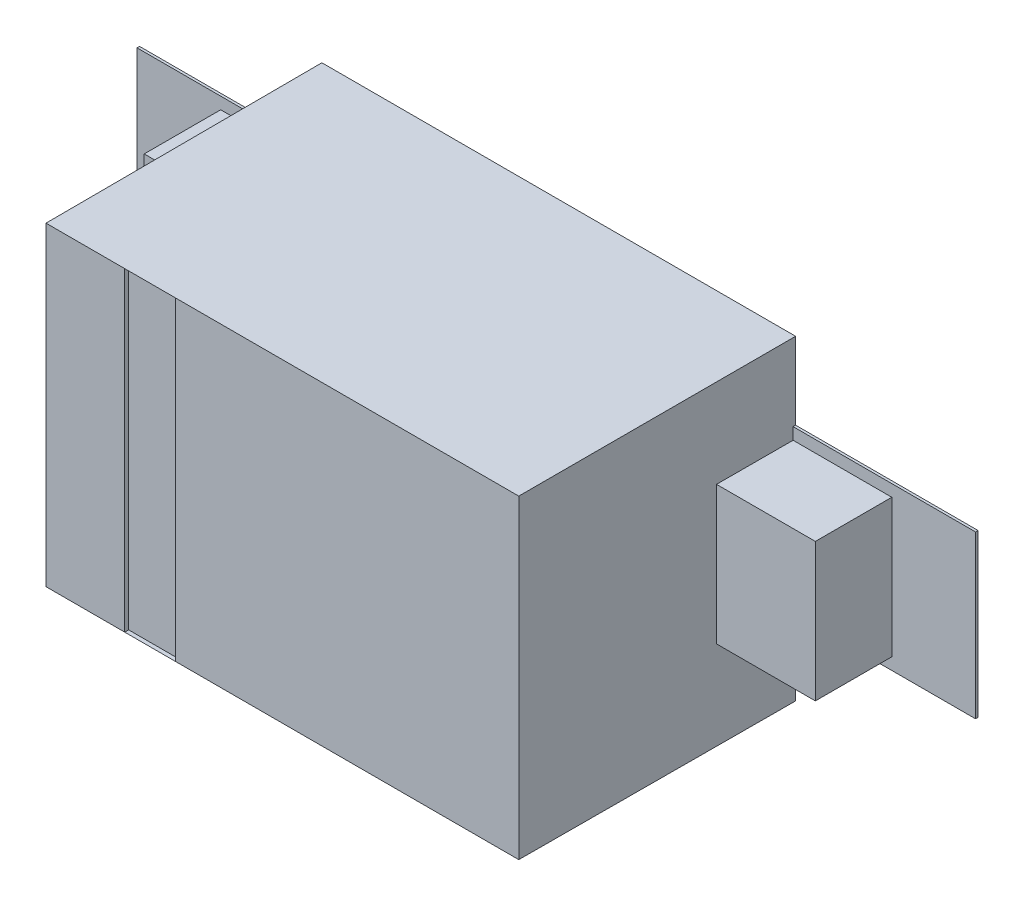
ISO-10303-21;
HEADER;
FILE_DESCRIPTION(('STEP AP214'),'2;1');
FILE_NAME('part.step','',(''),(''),'','','');
FILE_SCHEMA(('AUTOMOTIVE_DESIGN { 1 0 10303 214 1 1 1 1 }'));
ENDSEC;
DATA;
#1=APPLICATION_CONTEXT('core data for automotive mechanical design processes');
#2=APPLICATION_PROTOCOL_DEFINITION('international standard','automotive_design',2000,#1);
#3=PRODUCT_CONTEXT('',#1,'mechanical');
#4=PRODUCT('Part','Part','',(#3));
#5=PRODUCT_RELATED_PRODUCT_CATEGORY('part','',(#4));
#6=PRODUCT_DEFINITION_FORMATION('','',#4);
#7=PRODUCT_DEFINITION_CONTEXT('part definition',#1,'design');
#8=PRODUCT_DEFINITION('design','',#6,#7);
#9=PRODUCT_DEFINITION_SHAPE('','',#8);
#10=(LENGTH_UNIT() NAMED_UNIT(*) SI_UNIT(.MILLI.,.METRE.));
#11=(NAMED_UNIT(*) PLANE_ANGLE_UNIT() SI_UNIT($,.RADIAN.));
#12=(NAMED_UNIT(*) SI_UNIT($,.STERADIAN.) SOLID_ANGLE_UNIT());
#13=UNCERTAINTY_MEASURE_WITH_UNIT(LENGTH_MEASURE(1.E-05),#10,'distance_accuracy_value','');
#14=(GEOMETRIC_REPRESENTATION_CONTEXT(3) GLOBAL_UNCERTAINTY_ASSIGNED_CONTEXT((#13)) GLOBAL_UNIT_ASSIGNED_CONTEXT((#10,
#11,#12)) REPRESENTATION_CONTEXT('',''));
#15=CARTESIAN_POINT('',(0.,0.,0.));
#16=DIRECTION('',(0.,0.,1.));
#17=DIRECTION('',(1.,0.,0.));
#18=AXIS2_PLACEMENT_3D('',#15,#16,#17);
#19=CARTESIAN_POINT('',(0.849999999999902,0.175000000000011,0.0030000000000007));
#20=DIRECTION('',(1.,0.,0.));
#21=DIRECTION('',(0.,0.,-1.));
#22=AXIS2_PLACEMENT_3D('',#19,#20,#21);
#23=PLANE('',#22);
#24=DIRECTION('',(0.,0.,-1.));
#25=VECTOR('',#24,1.);
#26=CARTESIAN_POINT('',(0.849999999999902,-0.175000000000011,0.0030000000000007));
#27=LINE('',#26,#25);
#28=CARTESIAN_POINT('',(0.849999999999902,-0.175000000000011,0.0093500000000007));
#29=VERTEX_POINT('',#28);
#30=CARTESIAN_POINT('',(0.849999999999902,-0.175000000000011,0.203000000000001));
#31=VERTEX_POINT('',#30);
#32=EDGE_CURVE('E175',#29,#31,#27,.F.);
#33=ORIENTED_EDGE('',*,*,#32,.F.);
#34=DIRECTION('',(0.,1.,0.));
#35=VECTOR('',#34,1.);
#36=CARTESIAN_POINT('',(0.849999999999902,0.,0.0093500000000007));
#37=LINE('',#36,#35);
#38=CARTESIAN_POINT('',(0.849999999999902,0.175000000000011,0.0093500000000007));
#39=VERTEX_POINT('',#38);
#40=EDGE_CURVE('E182',#29,#39,#37,.T.);
#41=ORIENTED_EDGE('',*,*,#40,.T.);
#42=DIRECTION('',(0.,0.,1.));
#43=VECTOR('',#42,1.);
#44=CARTESIAN_POINT('',(0.849999999999902,0.175000000000011,0.0030000000000007));
#45=LINE('',#44,#43);
#46=CARTESIAN_POINT('',(0.849999999999902,0.175000000000011,0.203000000000001));
#47=VERTEX_POINT('',#46);
#48=EDGE_CURVE('E343',#47,#39,#45,.F.);
#49=ORIENTED_EDGE('',*,*,#48,.F.);
#50=DIRECTION('',(0.,1.,0.));
#51=VECTOR('',#50,1.);
#52=CARTESIAN_POINT('',(0.849999999999902,0.,0.203000000000001));
#53=LINE('',#52,#51);
#54=EDGE_CURVE('E194',#47,#31,#53,.F.);
#55=ORIENTED_EDGE('',*,*,#54,.T.);
#56=EDGE_LOOP('',(#33,#41,#49,#55));
#57=FACE_BOUND('',#56,.T.);
#58=ADVANCED_FACE('F17',(#57),#23,.T.);
#59=CARTESIAN_POINT('',(-0.849999999999902,-0.175000000000011,0.0030000000000007));
#60=DIRECTION('',(-1.,0.,0.));
#61=DIRECTION('',(0.,0.,1.));
#62=AXIS2_PLACEMENT_3D('',#59,#60,#61);
#63=PLANE('',#62);
#64=DIRECTION('',(0.,0.,1.));
#65=VECTOR('',#64,1.);
#66=CARTESIAN_POINT('',(-0.849999999999902,0.175000000000011,0.0030000000000007));
#67=LINE('',#66,#65);
#68=CARTESIAN_POINT('',(-0.849999999999902,0.175000000000011,0.0093500000000007));
#69=VERTEX_POINT('',#68);
#70=CARTESIAN_POINT('',(-0.849999999999902,0.175000000000011,0.203000000000001));
#71=VERTEX_POINT('',#70);
#72=EDGE_CURVE('E323',#69,#71,#67,.T.);
#73=ORIENTED_EDGE('',*,*,#72,.F.);
#74=DIRECTION('',(0.,1.,0.));
#75=VECTOR('',#74,1.);
#76=CARTESIAN_POINT('',(-0.849999999999902,0.,0.0093500000000007));
#77=LINE('',#76,#75);
#78=CARTESIAN_POINT('',(-0.849999999999902,-0.175000000000011,0.0093500000000007));
#79=VERTEX_POINT('',#78);
#80=EDGE_CURVE('E330',#69,#79,#77,.F.);
#81=ORIENTED_EDGE('',*,*,#80,.T.);
#82=DIRECTION('',(0.,0.,-1.));
#83=VECTOR('',#82,1.);
#84=CARTESIAN_POINT('',(-0.849999999999902,-0.175000000000011,0.0030000000000007));
#85=LINE('',#84,#83);
#86=CARTESIAN_POINT('',(-0.849999999999902,-0.175000000000011,0.203000000000001));
#87=VERTEX_POINT('',#86);
#88=EDGE_CURVE('E312',#87,#79,#85,.T.);
#89=ORIENTED_EDGE('',*,*,#88,.F.);
#90=DIRECTION('',(0.,1.,0.));
#91=VECTOR('',#90,1.);
#92=CARTESIAN_POINT('',(-0.849999999999902,0.,0.203000000000001));
#93=LINE('',#92,#91);
#94=EDGE_CURVE('E320',#87,#71,#93,.T.);
#95=ORIENTED_EDGE('',*,*,#94,.T.);
#96=EDGE_LOOP('',(#73,#81,#89,#95));
#97=FACE_BOUND('',#96,.T.);
#98=ADVANCED_FACE('F654',(#97),#63,.T.);
#99=CARTESIAN_POINT('',(-0.399389278385962,0.398778226395216,0.703023999999988));
#100=DIRECTION('',(-1.,0.,0.));
#101=DIRECTION('',(0.,0.,1.));
#102=AXIS2_PLACEMENT_3D('',#99,#100,#101);
#103=PLANE('',#102);
#104=DIRECTION('',(0.,1.,0.));
#105=VECTOR('',#104,1.);
#106=CARTESIAN_POINT('',(-0.399389278385962,0.,0.693024000000028));
#107=LINE('',#106,#105);
#108=CARTESIAN_POINT('',(-0.399389278385962,0.398778226395216,0.693024000000028));
#109=VERTEX_POINT('',#108);
#110=CARTESIAN_POINT('',(-0.399389278385962,-0.398778226395216,0.693024000000028));
#111=VERTEX_POINT('',#110);
#112=EDGE_CURVE('E203',#109,#111,#107,.F.);
#113=ORIENTED_EDGE('',*,*,#112,.F.);
#114=DIRECTION('',(0.,0.,1.));
#115=VECTOR('',#114,1.);
#116=CARTESIAN_POINT('',(-0.399389278385962,0.398778226395216,0.703023999999988));
#117=LINE('',#116,#115);
#118=CARTESIAN_POINT('',(-0.399389278385962,0.398778226395195,0.703023999999988));
#119=VERTEX_POINT('',#118);
#120=EDGE_CURVE('E223',#109,#119,#117,.T.);
#121=ORIENTED_EDGE('',*,*,#120,.T.);
#122=DIRECTION('',(0.,1.,0.));
#123=VECTOR('',#122,1.);
#124=CARTESIAN_POINT('',(-0.399389278385962,0.,0.703023999999988));
#125=LINE('',#124,#123);
#126=CARTESIAN_POINT('',(-0.399389278385962,-0.398778226395195,0.703023999999988));
#127=VERTEX_POINT('',#126);
#128=EDGE_CURVE('E220',#127,#119,#125,.T.);
#129=ORIENTED_EDGE('',*,*,#128,.F.);
#130=DIRECTION('',(0.,0.,1.));
#131=VECTOR('',#130,1.);
#132=CARTESIAN_POINT('',(-0.399389278385962,-0.398778226395216,0.703023999999988));
#133=LINE('',#132,#131);
#134=EDGE_CURVE('E20',#111,#127,#133,.T.);
#135=ORIENTED_EDGE('',*,*,#134,.F.);
#136=EDGE_LOOP('',(#113,#121,#129,#135));
#137=FACE_BOUND('',#136,.T.);
#138=ADVANCED_FACE('F221',(#137),#103,.F.);
#139=CARTESIAN_POINT('',(-0.270648412093,-0.398778226395216,0.703023999999988));
#140=DIRECTION('',(1.,0.,0.));
#141=DIRECTION('',(0.,0.,-1.));
#142=AXIS2_PLACEMENT_3D('',#139,#140,#141);
#143=PLANE('',#142);
#144=DIRECTION('',(0.,1.,0.));
#145=VECTOR('',#144,1.);
#146=CARTESIAN_POINT('',(-0.270648412093,0.,0.693024000000028));
#147=LINE('',#146,#145);
#148=CARTESIAN_POINT('',(-0.270648412093,-0.398778226395216,0.693024000000028));
#149=VERTEX_POINT('',#148);
#150=CARTESIAN_POINT('',(-0.270648412093,0.398778226395216,0.693024000000028));
#151=VERTEX_POINT('',#150);
#152=EDGE_CURVE('E206',#149,#151,#147,.T.);
#153=ORIENTED_EDGE('',*,*,#152,.F.);
#154=DIRECTION('',(0.,0.,-1.));
#155=VECTOR('',#154,1.);
#156=CARTESIAN_POINT('',(-0.270648412093,-0.398778226395216,0.703023999999988));
#157=LINE('',#156,#155);
#158=CARTESIAN_POINT('',(-0.270648412093,-0.398778226395195,0.703023999999988));
#159=VERTEX_POINT('',#158);
#160=EDGE_CURVE('E207',#159,#149,#157,.T.);
#161=ORIENTED_EDGE('',*,*,#160,.F.);
#162=DIRECTION('',(0.,1.,0.));
#163=VECTOR('',#162,1.);
#164=CARTESIAN_POINT('',(-0.270648412093,0.,0.703023999999988));
#165=LINE('',#164,#163);
#166=CARTESIAN_POINT('',(-0.270648412093,0.398778226395195,0.703023999999988));
#167=VERTEX_POINT('',#166);
#168=EDGE_CURVE('E229',#167,#159,#165,.F.);
#169=ORIENTED_EDGE('',*,*,#168,.F.);
#170=DIRECTION('',(0.,0.,1.));
#171=VECTOR('',#170,1.);
#172=CARTESIAN_POINT('',(-0.270648412093,0.398778226395216,0.703023999999988));
#173=LINE('',#172,#171);
#174=EDGE_CURVE('E339',#167,#151,#173,.F.);
#175=ORIENTED_EDGE('',*,*,#174,.T.);
#176=EDGE_LOOP('',(#153,#161,#169,#175));
#177=FACE_BOUND('',#176,.T.);
#178=ADVANCED_FACE('F393',(#177),#143,.F.);
#179=CARTESIAN_POINT('',(0.,0.,0.693024000000028));
#180=DIRECTION('',(0.,0.,1.));
#181=DIRECTION('',(1.,0.,0.));
#182=AXIS2_PLACEMENT_3D('',#179,#180,#181);
#183=PLANE('',#182);
#184=DIRECTION('',(1.,0.,0.));
#185=VECTOR('',#184,1.);
#186=CARTESIAN_POINT('',(-0.270648412093,0.398778226395216,0.693024000000028));
#187=LINE('',#186,#185);
#188=EDGE_CURVE('E336',#151,#109,#187,.F.);
#189=ORIENTED_EDGE('',*,*,#188,.T.);
#190=ORIENTED_EDGE('',*,*,#112,.T.);
#191=DIRECTION('',(1.,0.,0.));
#192=VECTOR('',#191,1.);
#193=CARTESIAN_POINT('',(-0.399389278385962,-0.398778226395216,0.693024000000028));
#194=LINE('',#193,#192);
#195=EDGE_CURVE('E217',#111,#149,#194,.T.);
#196=ORIENTED_EDGE('',*,*,#195,.T.);
#197=ORIENTED_EDGE('',*,*,#152,.T.);
#198=EDGE_LOOP('',(#189,#190,#196,#197));
#199=FACE_BOUND('',#198,.T.);
#200=ADVANCED_FACE('F401',(#199),#183,.T.);
#201=CARTESIAN_POINT('',(0.,0.,0.0093500000000007));
#202=DIRECTION('',(0.,0.,-1.));
#203=DIRECTION('',(-1.,0.,0.));
#204=AXIS2_PLACEMENT_3D('',#201,#202,#203);
#205=PLANE('',#204);
#206=ORIENTED_EDGE('',*,*,#40,.F.);
#207=DIRECTION('',(1.,0.,0.));
#208=VECTOR('',#207,1.);
#209=CARTESIAN_POINT('',(0.849999999999902,-0.175000000000011,0.0093500000000007));
#210=LINE('',#209,#208);
#211=CARTESIAN_POINT('',(0.599988917147998,-0.175000000000011,0.00935000000000063));
#212=VERTEX_POINT('',#211);
#213=EDGE_CURVE('E184',#212,#29,#210,.T.);
#214=ORIENTED_EDGE('',*,*,#213,.F.);
#215=DIRECTION('',(0.,1.,0.));
#216=VECTOR('',#215,1.);
#217=CARTESIAN_POINT('',(0.599988917148036,0.,0.0093500000000007));
#218=LINE('',#217,#216);
#219=CARTESIAN_POINT('',(0.599988917147998,-0.204999999999993,0.00935000000000063));
#220=VERTEX_POINT('',#219);
#221=EDGE_CURVE('E190',#220,#212,#218,.T.);
#222=ORIENTED_EDGE('',*,*,#221,.F.);
#223=DIRECTION('',(1.,0.,0.));
#224=VECTOR('',#223,1.);
#225=CARTESIAN_POINT('',(1.06200000000007,-0.204999999999993,0.0093500000000007));
#226=LINE('',#225,#224);
#227=CARTESIAN_POINT('',(1.06200000000007,-0.204999999999993,0.0093500000000007));
#228=VERTEX_POINT('',#227);
#229=EDGE_CURVE('E304',#228,#220,#226,.F.);
#230=ORIENTED_EDGE('',*,*,#229,.F.);
#231=DIRECTION('',(0.,1.,0.));
#232=VECTOR('',#231,1.);
#233=CARTESIAN_POINT('',(1.06200000000007,0.204999999999993,0.0093500000000007));
#234=LINE('',#233,#232);
#235=CARTESIAN_POINT('',(1.06200000000007,0.204999999999993,0.0093500000000007));
#236=VERTEX_POINT('',#235);
#237=EDGE_CURVE('E302',#236,#228,#234,.F.);
#238=ORIENTED_EDGE('',*,*,#237,.F.);
#239=DIRECTION('',(1.,0.,0.));
#240=VECTOR('',#239,1.);
#241=CARTESIAN_POINT('',(0.372000000000036,0.204999999999993,0.0093500000000007));
#242=LINE('',#241,#240);
#243=CARTESIAN_POINT('',(0.599988917147998,0.204999999999993,0.00935000000000063));
#244=VERTEX_POINT('',#243);
#245=EDGE_CURVE('E298',#244,#236,#242,.T.);
#246=ORIENTED_EDGE('',*,*,#245,.F.);
#247=DIRECTION('',(0.,1.,0.));
#248=VECTOR('',#247,1.);
#249=CARTESIAN_POINT('',(0.599988917148036,0.,0.0093500000000007));
#250=LINE('',#249,#248);
#251=CARTESIAN_POINT('',(0.599988917147998,0.175000000000011,0.00935000000000063));
#252=VERTEX_POINT('',#251);
#253=EDGE_CURVE('E201',#252,#244,#250,.T.);
#254=ORIENTED_EDGE('',*,*,#253,.F.);
#255=DIRECTION('',(1.,0.,0.));
#256=VECTOR('',#255,1.);
#257=CARTESIAN_POINT('',(0.538999999999876,0.175000000000011,0.0093500000000007));
#258=LINE('',#257,#256);
#259=EDGE_CURVE('E187',#39,#252,#258,.F.);
#260=ORIENTED_EDGE('',*,*,#259,.F.);
#261=EDGE_LOOP('',(#206,#214,#222,#230,#238,#246,#254,#260));
#262=FACE_BOUND('',#261,.T.);
#263=ADVANCED_FACE('F183',(#262),#205,.F.);
#264=CARTESIAN_POINT('',(0.849999999999902,-0.175000000000011,0.0030000000000007));
#265=DIRECTION('',(0.,-1.,0.));
#266=DIRECTION('',(0.,0.,-1.));
#267=AXIS2_PLACEMENT_3D('',#264,#265,#266);
#268=PLANE('',#267);
#269=DIRECTION('',(0.00174532836589798,0.,-0.999998476913288));
#270=VECTOR('',#269,1.);
#271=CARTESIAN_POINT('',(0.599999999999886,-0.175000000000012,0.0030000000000007));
#272=LINE('',#271,#270);
#273=CARTESIAN_POINT('',(0.599650933795048,-0.175000000000011,0.203000000000001));
#274=VERTEX_POINT('',#273);
#275=EDGE_CURVE('E193',#212,#274,#272,.F.);
#276=ORIENTED_EDGE('',*,*,#275,.F.);
#277=ORIENTED_EDGE('',*,*,#213,.T.);
#278=ORIENTED_EDGE('',*,*,#32,.T.);
#279=DIRECTION('',(-1.,0.,0.));
#280=VECTOR('',#279,1.);
#281=CARTESIAN_POINT('',(0.,-0.175000000000011,0.203000000000001));
#282=LINE('',#281,#280);
#283=EDGE_CURVE('E348',#31,#274,#282,.T.);
#284=ORIENTED_EDGE('',*,*,#283,.T.);
#285=EDGE_LOOP('',(#276,#277,#278,#284));
#286=FACE_BOUND('',#285,.T.);
#287=ADVANCED_FACE('F192',(#286),#268,.T.);
#288=CARTESIAN_POINT('',(0.,0.,0.203000000000001));
#289=DIRECTION('',(0.,0.,-1.));
#290=DIRECTION('',(-1.,0.,0.));
#291=AXIS2_PLACEMENT_3D('',#288,#289,#290);
#292=PLANE('',#291);
#293=ORIENTED_EDGE('',*,*,#54,.F.);
#294=DIRECTION('',(1.,0.,0.));
#295=VECTOR('',#294,1.);
#296=CARTESIAN_POINT('',(0.538999999999876,0.175000000000011,0.203000000000001));
#297=LINE('',#296,#295);
#298=CARTESIAN_POINT('',(0.599650933795048,0.175000000000011,0.203000000000001));
#299=VERTEX_POINT('',#298);
#300=EDGE_CURVE('E345',#299,#47,#297,.T.);
#301=ORIENTED_EDGE('',*,*,#300,.F.);
#302=DIRECTION('',(0.,1.,0.));
#303=VECTOR('',#302,1.);
#304=CARTESIAN_POINT('',(0.599650933795048,-25.831235540372,0.203000000000001));
#305=LINE('',#304,#303);
#306=EDGE_CURVE('E286',#274,#299,#305,.T.);
#307=ORIENTED_EDGE('',*,*,#306,.F.);
#308=ORIENTED_EDGE('',*,*,#283,.F.);
#309=EDGE_LOOP('',(#293,#301,#307,#308));
#310=FACE_BOUND('',#309,.T.);
#311=ADVANCED_FACE('F352',(#310),#292,.F.);
#312=CARTESIAN_POINT('',(0.538999999999876,0.175000000000011,0.0030000000000007));
#313=DIRECTION('',(0.,1.,0.));
#314=DIRECTION('',(0.,0.,1.));
#315=AXIS2_PLACEMENT_3D('',#312,#313,#314);
#316=PLANE('',#315);
#317=ORIENTED_EDGE('',*,*,#48,.T.);
#318=ORIENTED_EDGE('',*,*,#259,.T.);
#319=DIRECTION('',(0.00174532836589798,0.,-0.999998476913288));
#320=VECTOR('',#319,1.);
#321=CARTESIAN_POINT('',(0.599999999999886,0.175000000000012,0.0030000000000007));
#322=LINE('',#321,#320);
#323=EDGE_CURVE('E283',#299,#252,#322,.T.);
#324=ORIENTED_EDGE('',*,*,#323,.F.);
#325=ORIENTED_EDGE('',*,*,#300,.T.);
#326=EDGE_LOOP('',(#317,#318,#324,#325));
#327=FACE_BOUND('',#326,.T.);
#328=ADVANCED_FACE('F470',(#327),#316,.T.);
#329=CARTESIAN_POINT('',(-0.270648412093,0.398778226395216,0.703023999999988));
#330=DIRECTION('',(0.,1.,0.));
#331=DIRECTION('',(0.,0.,1.));
#332=AXIS2_PLACEMENT_3D('',#329,#330,#331);
#333=PLANE('',#332);
#334=ORIENTED_EDGE('',*,*,#188,.F.);
#335=ORIENTED_EDGE('',*,*,#174,.F.);
#336=DIRECTION('',(1.,0.,0.));
#337=VECTOR('',#336,1.);
#338=CARTESIAN_POINT('',(26.0312355403712,0.398778226395048,0.703023999999988));
#339=LINE('',#338,#337);
#340=EDGE_CURVE('E274',#119,#167,#339,.T.);
#341=ORIENTED_EDGE('',*,*,#340,.F.);
#342=ORIENTED_EDGE('',*,*,#120,.F.);
#343=EDGE_LOOP('',(#334,#335,#341,#342));
#344=FACE_BOUND('',#343,.T.);
#345=ADVANCED_FACE('F399',(#344),#333,.F.);
#346=CARTESIAN_POINT('',(0.,0.,0.0093500000000007));
#347=DIRECTION('',(0.,0.,-1.));
#348=DIRECTION('',(-1.,0.,0.));
#349=AXIS2_PLACEMENT_3D('',#346,#347,#348);
#350=PLANE('',#349);
#351=DIRECTION('',(0.,1.,0.));
#352=VECTOR('',#351,1.);
#353=CARTESIAN_POINT('',(-1.06200000000007,-0.204999999999993,0.0093500000000007));
#354=LINE('',#353,#352);
#355=CARTESIAN_POINT('',(-1.06200000000007,-0.204999999999993,0.0093500000000007));
#356=VERTEX_POINT('',#355);
#357=CARTESIAN_POINT('',(-1.06200000000007,0.204999999999993,0.0093500000000007));
#358=VERTEX_POINT('',#357);
#359=EDGE_CURVE('E269',#356,#358,#354,.T.);
#360=ORIENTED_EDGE('',*,*,#359,.F.);
#361=DIRECTION('',(1.,0.,0.));
#362=VECTOR('',#361,1.);
#363=CARTESIAN_POINT('',(-0.372000000000036,-0.204999999999993,0.0093500000000007));
#364=LINE('',#363,#362);
#365=CARTESIAN_POINT('',(-0.599988917147998,-0.204999999999993,0.00935000000000063));
#366=VERTEX_POINT('',#365);
#367=EDGE_CURVE('E265',#366,#356,#364,.F.);
#368=ORIENTED_EDGE('',*,*,#367,.F.);
#369=DIRECTION('',(0.,1.,0.));
#370=VECTOR('',#369,1.);
#371=CARTESIAN_POINT('',(-0.599988917148036,0.,0.0093500000000007));
#372=LINE('',#371,#370);
#373=CARTESIAN_POINT('',(-0.599988917147998,-0.175000000000011,0.00935000000000063));
#374=VERTEX_POINT('',#373);
#375=EDGE_CURVE('E328',#374,#366,#372,.F.);
#376=ORIENTED_EDGE('',*,*,#375,.F.);
#377=DIRECTION('',(1.,0.,0.));
#378=VECTOR('',#377,1.);
#379=CARTESIAN_POINT('',(-0.538999999999876,-0.175000000000011,0.0093500000000007));
#380=LINE('',#379,#378);
#381=EDGE_CURVE('E230',#79,#374,#380,.T.);
#382=ORIENTED_EDGE('',*,*,#381,.F.);
#383=ORIENTED_EDGE('',*,*,#80,.F.);
#384=DIRECTION('',(1.,0.,0.));
#385=VECTOR('',#384,1.);
#386=CARTESIAN_POINT('',(-0.849999999999902,0.175000000000011,0.0093500000000007));
#387=LINE('',#386,#385);
#388=CARTESIAN_POINT('',(-0.599988917147998,0.175000000000011,0.00935000000000063));
#389=VERTEX_POINT('',#388);
#390=EDGE_CURVE('E325',#389,#69,#387,.F.);
#391=ORIENTED_EDGE('',*,*,#390,.F.);
#392=DIRECTION('',(0.,1.,0.));
#393=VECTOR('',#392,1.);
#394=CARTESIAN_POINT('',(-0.599988917148036,0.,0.0093500000000007));
#395=LINE('',#394,#393);
#396=CARTESIAN_POINT('',(-0.599988917147998,0.204999999999993,0.00935000000000063));
#397=VERTEX_POINT('',#396);
#398=EDGE_CURVE('E333',#397,#389,#395,.F.);
#399=ORIENTED_EDGE('',*,*,#398,.F.);
#400=DIRECTION('',(1.,0.,0.));
#401=VECTOR('',#400,1.);
#402=CARTESIAN_POINT('',(-1.06200000000007,0.204999999999993,0.0093500000000007));
#403=LINE('',#402,#401);
#404=EDGE_CURVE('E271',#358,#397,#403,.T.);
#405=ORIENTED_EDGE('',*,*,#404,.F.);
#406=EDGE_LOOP('',(#360,#368,#376,#382,#383,#391,#399,#405));
#407=FACE_BOUND('',#406,.T.);
#408=ADVANCED_FACE('F463',(#407),#350,.F.);
#409=CARTESIAN_POINT('',(-0.849999999999902,0.175000000000011,0.0030000000000007));
#410=DIRECTION('',(0.,1.,0.));
#411=DIRECTION('',(0.,0.,1.));
#412=AXIS2_PLACEMENT_3D('',#409,#410,#411);
#413=PLANE('',#412);
#414=DIRECTION('',(-1.,0.,0.));
#415=VECTOR('',#414,1.);
#416=CARTESIAN_POINT('',(0.,0.175000000000011,0.203000000000001));
#417=LINE('',#416,#415);
#418=CARTESIAN_POINT('',(-0.599650933795048,0.175000000000011,0.203000000000001));
#419=VERTEX_POINT('',#418);
#420=EDGE_CURVE('E317',#71,#419,#417,.F.);
#421=ORIENTED_EDGE('',*,*,#420,.T.);
#422=DIRECTION('',(0.00174532836589798,0.,0.999998476913288));
#423=VECTOR('',#422,1.);
#424=CARTESIAN_POINT('',(-0.599999999999886,0.175000000000012,0.0030000000000007));
#425=LINE('',#424,#423);
#426=EDGE_CURVE('E261',#389,#419,#425,.T.);
#427=ORIENTED_EDGE('',*,*,#426,.F.);
#428=ORIENTED_EDGE('',*,*,#390,.T.);
#429=ORIENTED_EDGE('',*,*,#72,.T.);
#430=EDGE_LOOP('',(#421,#427,#428,#429));
#431=FACE_BOUND('',#430,.T.);
#432=ADVANCED_FACE('F459',(#431),#413,.T.);
#433=CARTESIAN_POINT('',(0.,0.,0.203000000000001));
#434=DIRECTION('',(0.,0.,-1.));
#435=DIRECTION('',(-1.,0.,0.));
#436=AXIS2_PLACEMENT_3D('',#433,#434,#435);
#437=PLANE('',#436);
#438=ORIENTED_EDGE('',*,*,#94,.F.);
#439=DIRECTION('',(1.,0.,0.));
#440=VECTOR('',#439,1.);
#441=CARTESIAN_POINT('',(-0.538999999999876,-0.175000000000011,0.203000000000001));
#442=LINE('',#441,#440);
#443=CARTESIAN_POINT('',(-0.599650933795048,-0.175000000000011,0.203000000000001));
#444=VERTEX_POINT('',#443);
#445=EDGE_CURVE('E314',#444,#87,#442,.F.);
#446=ORIENTED_EDGE('',*,*,#445,.F.);
#447=DIRECTION('',(0.,1.,0.));
#448=VECTOR('',#447,1.);
#449=CARTESIAN_POINT('',(-0.599650933795048,25.831235540372,0.203000000000001));
#450=LINE('',#449,#448);
#451=EDGE_CURVE('E259',#419,#444,#450,.F.);
#452=ORIENTED_EDGE('',*,*,#451,.F.);
#453=ORIENTED_EDGE('',*,*,#420,.F.);
#454=EDGE_LOOP('',(#438,#446,#452,#453));
#455=FACE_BOUND('',#454,.T.);
#456=ADVANCED_FACE('F455',(#455),#437,.F.);
#457=CARTESIAN_POINT('',(-0.538999999999876,-0.175000000000011,0.0030000000000007));
#458=DIRECTION('',(0.,-1.,0.));
#459=DIRECTION('',(0.,0.,-1.));
#460=AXIS2_PLACEMENT_3D('',#457,#458,#459);
#461=PLANE('',#460);
#462=ORIENTED_EDGE('',*,*,#381,.T.);
#463=DIRECTION('',(0.00174532836589798,0.,0.999998476913288));
#464=VECTOR('',#463,1.);
#465=CARTESIAN_POINT('',(-0.599999999999886,-0.175000000000012,0.0030000000000007));
#466=LINE('',#465,#464);
#467=EDGE_CURVE('E256',#444,#374,#466,.F.);
#468=ORIENTED_EDGE('',*,*,#467,.F.);
#469=ORIENTED_EDGE('',*,*,#445,.T.);
#470=ORIENTED_EDGE('',*,*,#88,.T.);
#471=EDGE_LOOP('',(#462,#468,#469,#470));
#472=FACE_BOUND('',#471,.T.);
#473=ADVANCED_FACE('F452',(#472),#461,.T.);
#474=CARTESIAN_POINT('',(0.,0.,0.703023999999988));
#475=DIRECTION('',(0.,0.,1.));
#476=DIRECTION('',(1.,0.,0.));
#477=AXIS2_PLACEMENT_3D('',#474,#475,#476);
#478=PLANE('',#477);
#479=DIRECTION('',(1.,0.,0.));
#480=VECTOR('',#479,1.);
#481=CARTESIAN_POINT('',(-26.0312355403712,-0.398778226395048,0.703023999999988));
#482=LINE('',#481,#480);
#483=CARTESIAN_POINT('',(-0.598778226395137,-0.398778226395174,0.703023999999988));
#484=VERTEX_POINT('',#483);
#485=EDGE_CURVE('E234',#127,#484,#482,.F.);
#486=ORIENTED_EDGE('',*,*,#485,.F.);
#487=ORIENTED_EDGE('',*,*,#128,.T.);
#488=DIRECTION('',(1.,0.,0.));
#489=VECTOR('',#488,1.);
#490=CARTESIAN_POINT('',(26.0312355403712,0.398778226395048,0.703023999999988));
#491=LINE('',#490,#489);
#492=CARTESIAN_POINT('',(-0.598778226395136,0.398778226395176,0.703023999999988));
#493=VERTEX_POINT('',#492);
#494=EDGE_CURVE('E277',#493,#119,#491,.T.);
#495=ORIENTED_EDGE('',*,*,#494,.F.);
#496=DIRECTION('',(0.,1.,0.));
#497=VECTOR('',#496,1.);
#498=CARTESIAN_POINT('',(-0.598778226395009,25.831235540372,0.703023999999988));
#499=LINE('',#498,#497);
#500=EDGE_CURVE('E242',#484,#493,#499,.T.);
#501=ORIENTED_EDGE('',*,*,#500,.F.);
#502=EDGE_LOOP('',(#486,#487,#495,#501));
#503=FACE_BOUND('',#502,.T.);
#504=ADVANCED_FACE('F241',(#503),#478,.T.);
#505=CARTESIAN_POINT('',(0.,0.,0.703023999999988));
#506=DIRECTION('',(0.,0.,1.));
#507=DIRECTION('',(1.,0.,0.));
#508=AXIS2_PLACEMENT_3D('',#505,#506,#507);
#509=PLANE('',#508);
#510=DIRECTION('',(1.,0.,0.));
#511=VECTOR('',#510,1.);
#512=CARTESIAN_POINT('',(26.0312355403712,0.398778226395048,0.703023999999988));
#513=LINE('',#512,#511);
#514=CARTESIAN_POINT('',(0.598778226395137,0.398778226395174,0.703023999999988));
#515=VERTEX_POINT('',#514);
#516=EDGE_CURVE('E281',#167,#515,#513,.T.);
#517=ORIENTED_EDGE('',*,*,#516,.F.);
#518=ORIENTED_EDGE('',*,*,#168,.T.);
#519=DIRECTION('',(1.,0.,0.));
#520=VECTOR('',#519,1.);
#521=CARTESIAN_POINT('',(-26.0312355403712,-0.398778226395048,0.703023999999988));
#522=LINE('',#521,#520);
#523=CARTESIAN_POINT('',(0.598778226395094,-0.398778226395177,0.703023999999988));
#524=VERTEX_POINT('',#523);
#525=EDGE_CURVE('E238',#524,#159,#522,.F.);
#526=ORIENTED_EDGE('',*,*,#525,.F.);
#527=DIRECTION('',(0.,1.,0.));
#528=VECTOR('',#527,1.);
#529=CARTESIAN_POINT('',(0.598778226395009,-25.831235540372,0.703023999999988));
#530=LINE('',#529,#528);
#531=EDGE_CURVE('E292',#515,#524,#530,.F.);
#532=ORIENTED_EDGE('',*,*,#531,.F.);
#533=EDGE_LOOP('',(#517,#518,#526,#532));
#534=FACE_BOUND('',#533,.T.);
#535=ADVANCED_FACE('F389',(#534),#509,.T.);
#536=CARTESIAN_POINT('',(-0.399389278385962,-0.398778226395216,0.703023999999988));
#537=DIRECTION('',(0.,-1.,0.));
#538=DIRECTION('',(0.,0.,-1.));
#539=AXIS2_PLACEMENT_3D('',#536,#537,#538);
#540=PLANE('',#539);
#541=ORIENTED_EDGE('',*,*,#195,.F.);
#542=ORIENTED_EDGE('',*,*,#134,.T.);
#543=DIRECTION('',(1.,0.,0.));
#544=VECTOR('',#543,1.);
#545=CARTESIAN_POINT('',(-26.0312355403712,-0.398778226395048,0.703023999999988));
#546=LINE('',#545,#544);
#547=EDGE_CURVE('E215',#159,#127,#546,.F.);
#548=ORIENTED_EDGE('',*,*,#547,.F.);
#549=ORIENTED_EDGE('',*,*,#160,.T.);
#550=EDGE_LOOP('',(#541,#542,#548,#549));
#551=FACE_BOUND('',#550,.T.);
#552=ADVANCED_FACE('F213',(#551),#540,.F.);
#553=CARTESIAN_POINT('',(1.06200000000007,-0.204999999999993,0.0030000000000007));
#554=DIRECTION('',(0.,-1.,0.));
#555=DIRECTION('',(0.,0.,-1.));
#556=AXIS2_PLACEMENT_3D('',#553,#554,#555);
#557=PLANE('',#556);
#558=ORIENTED_EDGE('',*,*,#229,.T.);
#559=DIRECTION('',(0.00174532836589798,0.,-0.999998476913288));
#560=VECTOR('',#559,1.);
#561=CARTESIAN_POINT('',(0.599999999999886,-0.204999999999993,0.0030000000000007));
#562=LINE('',#561,#560);
#563=CARTESIAN_POINT('',(0.599999999999886,-0.204999999999993,0.0030000000000007));
#564=VERTEX_POINT('',#563);
#565=EDGE_CURVE('E289',#564,#220,#562,.F.);
#566=ORIENTED_EDGE('',*,*,#565,.F.);
#567=DIRECTION('',(1.,0.,0.));
#568=VECTOR('',#567,1.);
#569=CARTESIAN_POINT('',(0.,-0.204999999999993,0.0030000000000007));
#570=LINE('',#569,#568);
#571=CARTESIAN_POINT('',(1.06200000000007,-0.204999999999993,0.0030000000000007));
#572=VERTEX_POINT('',#571);
#573=EDGE_CURVE('E364',#564,#572,#570,.T.);
#574=ORIENTED_EDGE('',*,*,#573,.T.);
#575=DIRECTION('',(0.,0.,-1.));
#576=VECTOR('',#575,1.);
#577=CARTESIAN_POINT('',(1.06200000000007,-0.204999999999993,0.0030000000000007));
#578=LINE('',#577,#576);
#579=EDGE_CURVE('E300',#228,#572,#578,.T.);
#580=ORIENTED_EDGE('',*,*,#579,.F.);
#581=EDGE_LOOP('',(#558,#566,#574,#580));
#582=FACE_BOUND('',#581,.T.);
#583=ADVANCED_FACE('F361',(#582),#557,.T.);
#584=CARTESIAN_POINT('',(1.06200000000007,0.204999999999993,0.0030000000000007));
#585=DIRECTION('',(1.,0.,0.));
#586=DIRECTION('',(0.,0.,-1.));
#587=AXIS2_PLACEMENT_3D('',#584,#585,#586);
#588=PLANE('',#587);
#589=ORIENTED_EDGE('',*,*,#579,.T.);
#590=DIRECTION('',(0.,1.,0.));
#591=VECTOR('',#590,1.);
#592=CARTESIAN_POINT('',(1.06200000000007,0.,0.0030000000000007));
#593=LINE('',#592,#591);
#594=CARTESIAN_POINT('',(1.06200000000007,0.204999999999993,0.0030000000000007));
#595=VERTEX_POINT('',#594);
#596=EDGE_CURVE('E370',#572,#595,#593,.T.);
#597=ORIENTED_EDGE('',*,*,#596,.T.);
#598=DIRECTION('',(0.,0.,1.));
#599=VECTOR('',#598,1.);
#600=CARTESIAN_POINT('',(1.06200000000007,0.204999999999993,0.0030000000000007));
#601=LINE('',#600,#599);
#602=EDGE_CURVE('E296',#236,#595,#601,.F.);
#603=ORIENTED_EDGE('',*,*,#602,.F.);
#604=ORIENTED_EDGE('',*,*,#237,.T.);
#605=EDGE_LOOP('',(#589,#597,#603,#604));
#606=FACE_BOUND('',#605,.T.);
#607=ADVANCED_FACE('F368',(#606),#588,.T.);
#608=CARTESIAN_POINT('',(0.372000000000036,0.204999999999993,0.0030000000000007));
#609=DIRECTION('',(0.,1.,0.));
#610=DIRECTION('',(0.,0.,1.));
#611=AXIS2_PLACEMENT_3D('',#608,#609,#610);
#612=PLANE('',#611);
#613=DIRECTION('',(1.,0.,0.));
#614=VECTOR('',#613,1.);
#615=CARTESIAN_POINT('',(0.,0.204999999999993,0.0030000000000007));
#616=LINE('',#615,#614);
#617=CARTESIAN_POINT('',(0.599999999999886,0.204999999999993,0.0030000000000007));
#618=VERTEX_POINT('',#617);
#619=EDGE_CURVE('E377',#595,#618,#616,.F.);
#620=ORIENTED_EDGE('',*,*,#619,.T.);
#621=DIRECTION('',(0.00174532836589798,0.,-0.999998476913288));
#622=VECTOR('',#621,1.);
#623=CARTESIAN_POINT('',(0.599999999999886,0.204999999999993,0.0030000000000007));
#624=LINE('',#623,#622);
#625=EDGE_CURVE('E294',#244,#618,#624,.T.);
#626=ORIENTED_EDGE('',*,*,#625,.F.);
#627=ORIENTED_EDGE('',*,*,#245,.T.);
#628=ORIENTED_EDGE('',*,*,#602,.T.);
#629=EDGE_LOOP('',(#620,#626,#627,#628));
#630=FACE_BOUND('',#629,.T.);
#631=ADVANCED_FACE('F438',(#630),#612,.T.);
#632=CARTESIAN_POINT('',(0.599999999999886,-25.831235540372,0.0030000000000007));
#633=DIRECTION('',(0.999998476913288,0.,0.00174532836589798));
#634=DIRECTION('',(0.00174532836589798,0.,-0.999998476913288));
#635=AXIS2_PLACEMENT_3D('',#632,#633,#634);
#636=PLANE('',#635);
#637=ORIENTED_EDGE('',*,*,#323,.T.);
#638=ORIENTED_EDGE('',*,*,#253,.T.);
#639=ORIENTED_EDGE('',*,*,#625,.T.);
#640=DIRECTION('',(0.,1.,0.));
#641=VECTOR('',#640,1.);
#642=CARTESIAN_POINT('',(0.599999999999886,0.,0.0030000000000007));
#643=LINE('',#642,#641);
#644=CARTESIAN_POINT('',(0.599999999999886,0.399999999999922,0.00300000000000071));
#645=VERTEX_POINT('',#644);
#646=EDGE_CURVE('E379',#618,#645,#643,.T.);
#647=ORIENTED_EDGE('',*,*,#646,.T.);
#648=DIRECTION('',(0.00174532570737786,0.00174532570761963,-0.999996953833535));
#649=VECTOR('',#648,1.);
#650=CARTESIAN_POINT('',(0.598778226395178,0.398778226395048,0.703023999999988));
#651=LINE('',#650,#649);
#652=EDGE_CURVE('E279',#515,#645,#651,.T.);
#653=ORIENTED_EDGE('',*,*,#652,.F.);
#654=ORIENTED_EDGE('',*,*,#531,.T.);
#655=DIRECTION('',(-0.00174532570737786,0.00174532570761963,0.999996953833535));
#656=VECTOR('',#655,1.);
#657=CARTESIAN_POINT('',(0.599999999999885,-0.399999999999924,0.0030000000000007));
#658=LINE('',#657,#656);
#659=CARTESIAN_POINT('',(0.599999999999885,-0.399999999999924,0.00300000000000071));
#660=VERTEX_POINT('',#659);
#661=EDGE_CURVE('E245',#660,#524,#658,.T.);
#662=ORIENTED_EDGE('',*,*,#661,.F.);
#663=DIRECTION('',(0.,1.,0.));
#664=VECTOR('',#663,1.);
#665=CARTESIAN_POINT('',(0.599999999999886,0.,0.0030000000000007));
#666=LINE('',#665,#664);
#667=EDGE_CURVE('E239',#660,#564,#666,.T.);
#668=ORIENTED_EDGE('',*,*,#667,.T.);
#669=ORIENTED_EDGE('',*,*,#565,.T.);
#670=ORIENTED_EDGE('',*,*,#221,.T.);
#671=ORIENTED_EDGE('',*,*,#275,.T.);
#672=ORIENTED_EDGE('',*,*,#306,.T.);
#673=EDGE_LOOP('',(#637,#638,#639,#647,#653,#654,#662,#668,#669,#670,#671,#672));
#674=FACE_BOUND('',#673,.T.);
#675=ADVANCED_FACE('F355',(#674),#636,.T.);
#676=CARTESIAN_POINT('',(26.0312355403712,0.399999999999924,0.0030000000000007));
#677=DIRECTION('',(0.,0.999998476913288,0.00174532836589798));
#678=DIRECTION('',(0.,-0.00174532836589798,0.999998476913288));
#679=AXIS2_PLACEMENT_3D('',#676,#677,#678);
#680=PLANE('',#679);
#681=ORIENTED_EDGE('',*,*,#494,.T.);
#682=ORIENTED_EDGE('',*,*,#340,.T.);
#683=ORIENTED_EDGE('',*,*,#516,.T.);
#684=ORIENTED_EDGE('',*,*,#652,.T.);
#685=DIRECTION('',(1.,0.,0.));
#686=VECTOR('',#685,1.);
#687=CARTESIAN_POINT('',(0.,0.399999999999924,0.0030000000000007));
#688=LINE('',#687,#686);
#689=CARTESIAN_POINT('',(-0.599999999999883,0.399999999999924,0.00300000000000071));
#690=VERTEX_POINT('',#689);
#691=EDGE_CURVE('E704',#645,#690,#688,.F.);
#692=ORIENTED_EDGE('',*,*,#691,.T.);
#693=DIRECTION('',(-0.00174532570761963,0.00174532570737786,-0.999996953833535));
#694=VECTOR('',#693,1.);
#695=CARTESIAN_POINT('',(-0.598778226395009,0.398778226395217,0.703023999999988));
#696=LINE('',#695,#694);
#697=EDGE_CURVE('E248',#493,#690,#696,.T.);
#698=ORIENTED_EDGE('',*,*,#697,.F.);
#699=EDGE_LOOP('',(#681,#682,#683,#684,#692,#698));
#700=FACE_BOUND('',#699,.T.);
#701=ADVANCED_FACE('F395',(#700),#680,.T.);
#702=CARTESIAN_POINT('',(-1.06200000000007,0.204999999999993,0.0030000000000007));
#703=DIRECTION('',(0.,1.,0.));
#704=DIRECTION('',(0.,0.,1.));
#705=AXIS2_PLACEMENT_3D('',#702,#703,#704);
#706=PLANE('',#705);
#707=ORIENTED_EDGE('',*,*,#404,.T.);
#708=DIRECTION('',(0.00174532836589798,0.,0.999998476913288));
#709=VECTOR('',#708,1.);
#710=CARTESIAN_POINT('',(-0.599999999999886,0.204999999999993,0.0030000000000007));
#711=LINE('',#710,#709);
#712=CARTESIAN_POINT('',(-0.599999999999886,0.204999999999993,0.0030000000000007));
#713=VERTEX_POINT('',#712);
#714=EDGE_CURVE('E243',#713,#397,#711,.T.);
#715=ORIENTED_EDGE('',*,*,#714,.F.);
#716=DIRECTION('',(1.,0.,0.));
#717=VECTOR('',#716,1.);
#718=CARTESIAN_POINT('',(0.,0.204999999999993,0.0030000000000007));
#719=LINE('',#718,#717);
#720=CARTESIAN_POINT('',(-1.06200000000007,0.204999999999993,0.0030000000000007));
#721=VERTEX_POINT('',#720);
#722=EDGE_CURVE('E697',#713,#721,#719,.F.);
#723=ORIENTED_EDGE('',*,*,#722,.T.);
#724=DIRECTION('',(0.,0.,1.));
#725=VECTOR('',#724,1.);
#726=CARTESIAN_POINT('',(-1.06200000000007,0.204999999999993,0.0030000000000007));
#727=LINE('',#726,#725);
#728=EDGE_CURVE('E267',#358,#721,#727,.F.);
#729=ORIENTED_EDGE('',*,*,#728,.F.);
#730=EDGE_LOOP('',(#707,#715,#723,#729));
#731=FACE_BOUND('',#730,.T.);
#732=ADVANCED_FACE('F429',(#731),#706,.T.);
#733=CARTESIAN_POINT('',(-1.06200000000007,-0.204999999999993,0.0030000000000007));
#734=DIRECTION('',(-1.,0.,0.));
#735=DIRECTION('',(0.,0.,1.));
#736=AXIS2_PLACEMENT_3D('',#733,#734,#735);
#737=PLANE('',#736);
#738=ORIENTED_EDGE('',*,*,#728,.T.);
#739=DIRECTION('',(0.,1.,0.));
#740=VECTOR('',#739,1.);
#741=CARTESIAN_POINT('',(-1.06200000000007,0.,0.0030000000000007));
#742=LINE('',#741,#740);
#743=CARTESIAN_POINT('',(-1.06200000000007,-0.204999999999993,0.0030000000000007));
#744=VERTEX_POINT('',#743);
#745=EDGE_CURVE('E695',#721,#744,#742,.F.);
#746=ORIENTED_EDGE('',*,*,#745,.T.);
#747=DIRECTION('',(0.,0.,-1.));
#748=VECTOR('',#747,1.);
#749=CARTESIAN_POINT('',(-1.06200000000007,-0.204999999999993,0.0030000000000007));
#750=LINE('',#749,#748);
#751=EDGE_CURVE('E263',#356,#744,#750,.T.);
#752=ORIENTED_EDGE('',*,*,#751,.F.);
#753=ORIENTED_EDGE('',*,*,#359,.T.);
#754=EDGE_LOOP('',(#738,#746,#752,#753));
#755=FACE_BOUND('',#754,.T.);
#756=ADVANCED_FACE('F425',(#755),#737,.T.);
#757=CARTESIAN_POINT('',(-0.372000000000036,-0.204999999999993,0.0030000000000007));
#758=DIRECTION('',(0.,-1.,0.));
#759=DIRECTION('',(0.,0.,-1.));
#760=AXIS2_PLACEMENT_3D('',#757,#758,#759);
#761=PLANE('',#760);
#762=DIRECTION('',(1.,0.,0.));
#763=VECTOR('',#762,1.);
#764=CARTESIAN_POINT('',(0.,-0.204999999999993,0.0030000000000007));
#765=LINE('',#764,#763);
#766=CARTESIAN_POINT('',(-0.599999999999886,-0.204999999999993,0.0030000000000007));
#767=VERTEX_POINT('',#766);
#768=EDGE_CURVE('E691',#744,#767,#765,.T.);
#769=ORIENTED_EDGE('',*,*,#768,.T.);
#770=DIRECTION('',(0.00174532836589798,0.,0.999998476913288));
#771=VECTOR('',#770,1.);
#772=CARTESIAN_POINT('',(-0.599999999999886,-0.204999999999993,0.0030000000000007));
#773=LINE('',#772,#771);
#774=EDGE_CURVE('E254',#366,#767,#773,.F.);
#775=ORIENTED_EDGE('',*,*,#774,.F.);
#776=ORIENTED_EDGE('',*,*,#367,.T.);
#777=ORIENTED_EDGE('',*,*,#751,.T.);
#778=EDGE_LOOP('',(#769,#775,#776,#777));
#779=FACE_BOUND('',#778,.T.);
#780=ADVANCED_FACE('F421',(#779),#761,.T.);
#781=CARTESIAN_POINT('',(-0.599999999999886,25.831235540372,0.0030000000000007));
#782=DIRECTION('',(-0.999998476913288,0.,0.00174532836589798));
#783=DIRECTION('',(0.00174532836589798,0.,0.999998476913288));
#784=AXIS2_PLACEMENT_3D('',#781,#782,#783);
#785=PLANE('',#784);
#786=ORIENTED_EDGE('',*,*,#714,.T.);
#787=ORIENTED_EDGE('',*,*,#398,.T.);
#788=ORIENTED_EDGE('',*,*,#426,.T.);
#789=ORIENTED_EDGE('',*,*,#451,.T.);
#790=ORIENTED_EDGE('',*,*,#467,.T.);
#791=ORIENTED_EDGE('',*,*,#375,.T.);
#792=ORIENTED_EDGE('',*,*,#774,.T.);
#793=DIRECTION('',(0.,1.,0.));
#794=VECTOR('',#793,1.);
#795=CARTESIAN_POINT('',(-0.599999999999886,0.,0.0030000000000007));
#796=LINE('',#795,#794);
#797=CARTESIAN_POINT('',(-0.599999999999886,-0.399999999999922,0.00300000000000071));
#798=VERTEX_POINT('',#797);
#799=EDGE_CURVE('E26',#767,#798,#796,.F.);
#800=ORIENTED_EDGE('',*,*,#799,.T.);
#801=DIRECTION('',(-0.00174532570737786,-0.00174532570761963,-0.999996953833535));
#802=VECTOR('',#801,1.);
#803=CARTESIAN_POINT('',(-0.598778226395178,-0.398778226395048,0.703023999999988));
#804=LINE('',#803,#802);
#805=EDGE_CURVE('E34',#484,#798,#804,.T.);
#806=ORIENTED_EDGE('',*,*,#805,.F.);
#807=ORIENTED_EDGE('',*,*,#500,.T.);
#808=ORIENTED_EDGE('',*,*,#697,.T.);
#809=DIRECTION('',(0.,1.,0.));
#810=VECTOR('',#809,1.);
#811=CARTESIAN_POINT('',(-0.599999999999886,0.,0.0030000000000007));
#812=LINE('',#811,#810);
#813=EDGE_CURVE('E702',#690,#713,#812,.F.);
#814=ORIENTED_EDGE('',*,*,#813,.T.);
#815=EDGE_LOOP('',(#786,#787,#788,#789,#790,#791,#792,#800,#806,#807,#808,#814));
#816=FACE_BOUND('',#815,.T.);
#817=ADVANCED_FACE('F416',(#816),#785,.T.);
#818=CARTESIAN_POINT('',(-26.0312355403712,-0.399999999999924,0.0030000000000007));
#819=DIRECTION('',(0.,-0.999998476913288,0.00174532836589798));
#820=DIRECTION('',(0.,-0.00174532836589798,-0.999998476913288));
#821=AXIS2_PLACEMENT_3D('',#818,#819,#820);
#822=PLANE('',#821);
#823=ORIENTED_EDGE('',*,*,#525,.T.);
#824=ORIENTED_EDGE('',*,*,#547,.T.);
#825=ORIENTED_EDGE('',*,*,#485,.T.);
#826=ORIENTED_EDGE('',*,*,#805,.T.);
#827=DIRECTION('',(1.,0.,0.));
#828=VECTOR('',#827,1.);
#829=CARTESIAN_POINT('',(0.,-0.399999999999924,0.0030000000000007));
#830=LINE('',#829,#828);
#831=EDGE_CURVE('E11',#798,#660,#830,.T.);
#832=ORIENTED_EDGE('',*,*,#831,.T.);
#833=ORIENTED_EDGE('',*,*,#661,.T.);
#834=EDGE_LOOP('',(#823,#824,#825,#826,#832,#833));
#835=FACE_BOUND('',#834,.T.);
#836=ADVANCED_FACE('F233',(#835),#822,.T.);
#837=CARTESIAN_POINT('',(0.,0.,0.0030000000000007));
#838=DIRECTION('',(0.,0.,1.));
#839=DIRECTION('',(1.,0.,0.));
#840=AXIS2_PLACEMENT_3D('',#837,#838,#839);
#841=PLANE('',#840);
#842=ORIENTED_EDGE('',*,*,#799,.F.);
#843=ORIENTED_EDGE('',*,*,#768,.F.);
#844=ORIENTED_EDGE('',*,*,#745,.F.);
#845=ORIENTED_EDGE('',*,*,#722,.F.);
#846=ORIENTED_EDGE('',*,*,#813,.F.);
#847=ORIENTED_EDGE('',*,*,#691,.F.);
#848=ORIENTED_EDGE('',*,*,#646,.F.);
#849=ORIENTED_EDGE('',*,*,#619,.F.);
#850=ORIENTED_EDGE('',*,*,#596,.F.);
#851=ORIENTED_EDGE('',*,*,#573,.F.);
#852=ORIENTED_EDGE('',*,*,#667,.F.);
#853=ORIENTED_EDGE('',*,*,#831,.F.);
#854=EDGE_LOOP('',(#842,#843,#844,#845,#846,#847,#848,#849,#850,#851,#852,#853));
#855=FACE_BOUND('',#854,.T.);
#856=ADVANCED_FACE('F374',(#855),#841,.F.);
#857=CLOSED_SHELL('',(#58,#98,#138,#178,#200,#263,#287,#311,#328,#345,#408,#432,#456,#473,#504,
#535,#552,#583,#607,#631,#675,#701,#732,#756,#780,#817,#836,#856));
#858=MANIFOLD_SOLID_BREP('B1',#857);
#859=ADVANCED_BREP_SHAPE_REPRESENTATION('',(#18,#858),#14);
#860=SHAPE_DEFINITION_REPRESENTATION(#9,#859);
ENDSEC;
END-ISO-10303-21;
